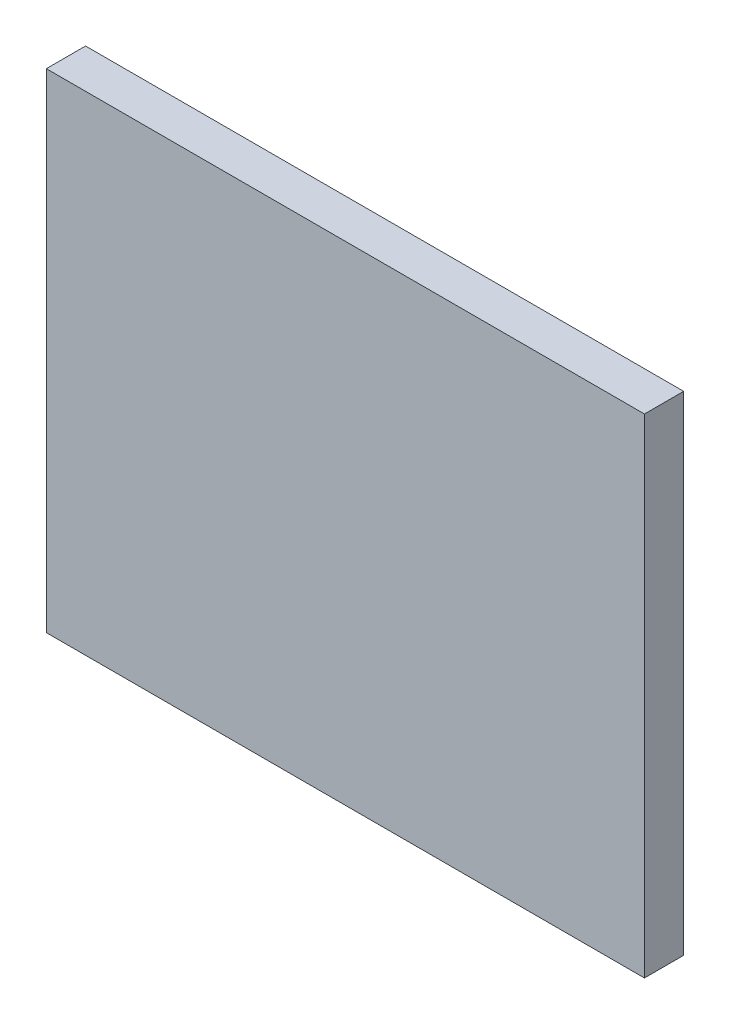
ISO-10303-21;
HEADER;
FILE_DESCRIPTION(('STEP AP214'),'2;1');
FILE_NAME('part.step','',(''),(''),'','','');
FILE_SCHEMA(('AUTOMOTIVE_DESIGN { 1 0 10303 214 1 1 1 1 }'));
ENDSEC;
DATA;
#1=APPLICATION_CONTEXT('core data for automotive mechanical design processes');
#2=APPLICATION_PROTOCOL_DEFINITION('international standard','automotive_design',2000,#1);
#3=PRODUCT_CONTEXT('',#1,'mechanical');
#4=PRODUCT('Part','Part','',(#3));
#5=PRODUCT_RELATED_PRODUCT_CATEGORY('part','',(#4));
#6=PRODUCT_DEFINITION_FORMATION('','',#4);
#7=PRODUCT_DEFINITION_CONTEXT('part definition',#1,'design');
#8=PRODUCT_DEFINITION('design','',#6,#7);
#9=PRODUCT_DEFINITION_SHAPE('','',#8);
#10=(LENGTH_UNIT() NAMED_UNIT(*) SI_UNIT(.MILLI.,.METRE.));
#11=(NAMED_UNIT(*) PLANE_ANGLE_UNIT() SI_UNIT($,.RADIAN.));
#12=(NAMED_UNIT(*) SI_UNIT($,.STERADIAN.) SOLID_ANGLE_UNIT());
#13=UNCERTAINTY_MEASURE_WITH_UNIT(LENGTH_MEASURE(1.E-05),#10,'distance_accuracy_value','');
#14=(GEOMETRIC_REPRESENTATION_CONTEXT(3) GLOBAL_UNCERTAINTY_ASSIGNED_CONTEXT((#13)) GLOBAL_UNIT_ASSIGNED_CONTEXT((#10,
#11,#12)) REPRESENTATION_CONTEXT('',''));
#15=CARTESIAN_POINT('',(0.,0.,0.));
#16=DIRECTION('',(0.,0.,1.));
#17=DIRECTION('',(1.,0.,0.));
#18=AXIS2_PLACEMENT_3D('',#15,#16,#17);
#19=CARTESIAN_POINT('',(-7.62,-1.524,1.));
#20=DIRECTION('',(1.,0.,0.));
#21=DIRECTION('',(0.,0.,-1.));
#22=AXIS2_PLACEMENT_3D('',#19,#20,#21);
#23=PLANE('',#22);
#24=DIRECTION('',(0.,-1.,0.));
#25=VECTOR('',#24,1.);
#26=CARTESIAN_POINT('',(-7.62,-1.524,0.));
#27=LINE('',#26,#25);
#28=CARTESIAN_POINT('',(-7.62,10.922,0.));
#29=VERTEX_POINT('',#28);
#30=CARTESIAN_POINT('',(-7.62,-1.524,0.));
#31=VERTEX_POINT('',#30);
#32=EDGE_CURVE('E95',#29,#31,#27,.T.);
#33=ORIENTED_EDGE('',*,*,#32,.T.);
#34=DIRECTION('',(0.,0.,-1.));
#35=VECTOR('',#34,1.);
#36=CARTESIAN_POINT('',(-7.62,-1.524,1.));
#37=LINE('',#36,#35);
#38=CARTESIAN_POINT('',(-7.62,-1.524,1.));
#39=VERTEX_POINT('',#38);
#40=EDGE_CURVE('E11',#39,#31,#37,.T.);
#41=ORIENTED_EDGE('',*,*,#40,.F.);
#42=DIRECTION('',(0.,-1.,0.));
#43=VECTOR('',#42,1.);
#44=CARTESIAN_POINT('',(-7.62,-1.524,1.));
#45=LINE('',#44,#43);
#46=CARTESIAN_POINT('',(-7.62,10.922,1.));
#47=VERTEX_POINT('',#46);
#48=EDGE_CURVE('E83',#47,#39,#45,.T.);
#49=ORIENTED_EDGE('',*,*,#48,.F.);
#50=DIRECTION('',(0.,0.,-1.));
#51=VECTOR('',#50,1.);
#52=CARTESIAN_POINT('',(-7.62,10.922,1.));
#53=LINE('',#52,#51);
#54=EDGE_CURVE('E91',#47,#29,#53,.T.);
#55=ORIENTED_EDGE('',*,*,#54,.T.);
#56=EDGE_LOOP('',(#33,#41,#49,#55));
#57=FACE_BOUND('',#56,.T.);
#58=ADVANCED_FACE('F32',(#57),#23,.F.);
#59=CARTESIAN_POINT('',(7.62,-1.524,1.));
#60=DIRECTION('',(0.,1.,0.));
#61=DIRECTION('',(0.,0.,1.));
#62=AXIS2_PLACEMENT_3D('',#59,#60,#61);
#63=PLANE('',#62);
#64=DIRECTION('',(1.,0.,0.));
#65=VECTOR('',#64,1.);
#66=CARTESIAN_POINT('',(7.62,-1.524,0.));
#67=LINE('',#66,#65);
#68=CARTESIAN_POINT('',(7.62,-1.524,0.));
#69=VERTEX_POINT('',#68);
#70=EDGE_CURVE('E87',#31,#69,#67,.T.);
#71=ORIENTED_EDGE('',*,*,#70,.T.);
#72=DIRECTION('',(0.,0.,-1.));
#73=VECTOR('',#72,1.);
#74=CARTESIAN_POINT('',(7.62,-1.524,1.));
#75=LINE('',#74,#73);
#76=CARTESIAN_POINT('',(7.62,-1.524,1.));
#77=VERTEX_POINT('',#76);
#78=EDGE_CURVE('E40',#77,#69,#75,.T.);
#79=ORIENTED_EDGE('',*,*,#78,.F.);
#80=DIRECTION('',(1.,0.,0.));
#81=VECTOR('',#80,1.);
#82=CARTESIAN_POINT('',(7.62,-1.524,1.));
#83=LINE('',#82,#81);
#84=EDGE_CURVE('E78',#39,#77,#83,.T.);
#85=ORIENTED_EDGE('',*,*,#84,.F.);
#86=ORIENTED_EDGE('',*,*,#40,.T.);
#87=EDGE_LOOP('',(#71,#79,#85,#86));
#88=FACE_BOUND('',#87,.T.);
#89=ADVANCED_FACE('F86',(#88),#63,.F.);
#90=CARTESIAN_POINT('',(7.62,10.922,1.));
#91=DIRECTION('',(-1.,0.,0.));
#92=DIRECTION('',(0.,0.,1.));
#93=AXIS2_PLACEMENT_3D('',#90,#91,#92);
#94=PLANE('',#93);
#95=DIRECTION('',(0.,1.,0.));
#96=VECTOR('',#95,1.);
#97=CARTESIAN_POINT('',(7.62,10.922,0.));
#98=LINE('',#97,#96);
#99=CARTESIAN_POINT('',(7.62,10.922,0.));
#100=VERTEX_POINT('',#99);
#101=EDGE_CURVE('E65',#69,#100,#98,.T.);
#102=ORIENTED_EDGE('',*,*,#101,.T.);
#103=DIRECTION('',(0.,0.,-1.));
#104=VECTOR('',#103,1.);
#105=CARTESIAN_POINT('',(7.62,10.922,1.));
#106=LINE('',#105,#104);
#107=CARTESIAN_POINT('',(7.62,10.922,1.));
#108=VERTEX_POINT('',#107);
#109=EDGE_CURVE('E88',#108,#100,#106,.T.);
#110=ORIENTED_EDGE('',*,*,#109,.F.);
#111=DIRECTION('',(0.,1.,0.));
#112=VECTOR('',#111,1.);
#113=CARTESIAN_POINT('',(7.62,10.922,1.));
#114=LINE('',#113,#112);
#115=EDGE_CURVE('E81',#77,#108,#114,.T.);
#116=ORIENTED_EDGE('',*,*,#115,.F.);
#117=ORIENTED_EDGE('',*,*,#78,.T.);
#118=EDGE_LOOP('',(#102,#110,#116,#117));
#119=FACE_BOUND('',#118,.T.);
#120=ADVANCED_FACE('F89',(#119),#94,.F.);
#121=CARTESIAN_POINT('',(-7.62,10.922,1.));
#122=DIRECTION('',(0.,-1.,0.));
#123=DIRECTION('',(0.,0.,-1.));
#124=AXIS2_PLACEMENT_3D('',#121,#122,#123);
#125=PLANE('',#124);
#126=DIRECTION('',(-1.,0.,0.));
#127=VECTOR('',#126,1.);
#128=CARTESIAN_POINT('',(-7.62,10.922,0.));
#129=LINE('',#128,#127);
#130=EDGE_CURVE('E71',#100,#29,#129,.T.);
#131=ORIENTED_EDGE('',*,*,#130,.T.);
#132=ORIENTED_EDGE('',*,*,#54,.F.);
#133=DIRECTION('',(-1.,0.,0.));
#134=VECTOR('',#133,1.);
#135=CARTESIAN_POINT('',(-7.62,10.922,1.));
#136=LINE('',#135,#134);
#137=EDGE_CURVE('E48',#108,#47,#136,.T.);
#138=ORIENTED_EDGE('',*,*,#137,.F.);
#139=ORIENTED_EDGE('',*,*,#109,.T.);
#140=EDGE_LOOP('',(#131,#132,#138,#139));
#141=FACE_BOUND('',#140,.T.);
#142=ADVANCED_FACE('F102',(#141),#125,.F.);
#143=CARTESIAN_POINT('',(0.,0.,1.));
#144=DIRECTION('',(0.,0.,-1.));
#145=DIRECTION('',(-1.,0.,0.));
#146=AXIS2_PLACEMENT_3D('',#143,#144,#145);
#147=PLANE('',#146);
#148=ORIENTED_EDGE('',*,*,#48,.T.);
#149=ORIENTED_EDGE('',*,*,#84,.T.);
#150=ORIENTED_EDGE('',*,*,#115,.T.);
#151=ORIENTED_EDGE('',*,*,#137,.T.);
#152=EDGE_LOOP('',(#148,#149,#150,#151));
#153=FACE_BOUND('',#152,.T.);
#154=ADVANCED_FACE('F79',(#153),#147,.F.);
#155=CARTESIAN_POINT('',(0.,0.,0.));
#156=DIRECTION('',(0.,0.,-1.));
#157=DIRECTION('',(-1.,0.,0.));
#158=AXIS2_PLACEMENT_3D('',#155,#156,#157);
#159=PLANE('',#158);
#160=ORIENTED_EDGE('',*,*,#32,.F.);
#161=ORIENTED_EDGE('',*,*,#130,.F.);
#162=ORIENTED_EDGE('',*,*,#101,.F.);
#163=ORIENTED_EDGE('',*,*,#70,.F.);
#164=EDGE_LOOP('',(#160,#161,#162,#163));
#165=FACE_BOUND('',#164,.T.);
#166=ADVANCED_FACE('F105',(#165),#159,.T.);
#167=CLOSED_SHELL('',(#58,#89,#120,#142,#154,#166));
#168=MANIFOLD_SOLID_BREP('B2',#167);
#169=ADVANCED_BREP_SHAPE_REPRESENTATION('',(#18,#168),#14);
#170=SHAPE_DEFINITION_REPRESENTATION(#9,#169);
ENDSEC;
END-ISO-10303-21;
